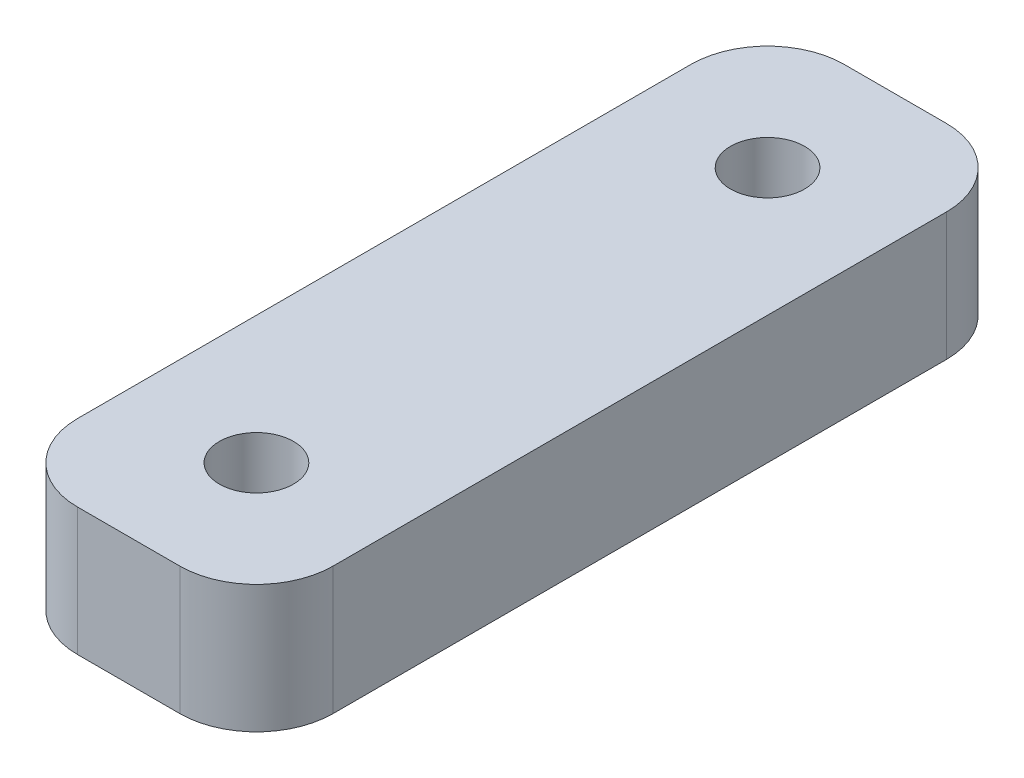
ISO-10303-21;
HEADER;
FILE_DESCRIPTION(('STEP AP214'),'2;1');
FILE_NAME('part.step','',(''),(''),'','','');
FILE_SCHEMA(('AUTOMOTIVE_DESIGN { 1 0 10303 214 1 1 1 1 }'));
ENDSEC;
DATA;
#1=APPLICATION_CONTEXT('core data for automotive mechanical design processes');
#2=APPLICATION_PROTOCOL_DEFINITION('international standard','automotive_design',2000,#1);
#3=PRODUCT_CONTEXT('',#1,'mechanical');
#4=PRODUCT('Part','Part','',(#3));
#5=PRODUCT_RELATED_PRODUCT_CATEGORY('part','',(#4));
#6=PRODUCT_DEFINITION_FORMATION('','',#4);
#7=PRODUCT_DEFINITION_CONTEXT('part definition',#1,'design');
#8=PRODUCT_DEFINITION('design','',#6,#7);
#9=PRODUCT_DEFINITION_SHAPE('','',#8);
#10=(LENGTH_UNIT() NAMED_UNIT(*) SI_UNIT(.MILLI.,.METRE.));
#11=(NAMED_UNIT(*) PLANE_ANGLE_UNIT() SI_UNIT($,.RADIAN.));
#12=(NAMED_UNIT(*) SI_UNIT($,.STERADIAN.) SOLID_ANGLE_UNIT());
#13=UNCERTAINTY_MEASURE_WITH_UNIT(LENGTH_MEASURE(1.E-05),#10,'distance_accuracy_value','');
#14=(GEOMETRIC_REPRESENTATION_CONTEXT(3) GLOBAL_UNCERTAINTY_ASSIGNED_CONTEXT((#13)) GLOBAL_UNIT_ASSIGNED_CONTEXT((#10,
#11,#12)) REPRESENTATION_CONTEXT('',''));
#15=CARTESIAN_POINT('',(0.,0.,0.));
#16=DIRECTION('',(0.,0.,1.));
#17=DIRECTION('',(1.,0.,0.));
#18=AXIS2_PLACEMENT_3D('',#15,#16,#17);
#19=CARTESIAN_POINT('',(0.,5.,0.));
#20=DIRECTION('',(0.,-1.,0.));
#21=DIRECTION('',(0.,0.,-1.));
#22=AXIS2_PLACEMENT_3D('',#19,#20,#21);
#23=PLANE('',#22);
#24=DIRECTION('',(0.,0.,-1.));
#25=VECTOR('',#24,1.);
#26=CARTESIAN_POINT('',(13.,5.,0.));
#27=LINE('',#26,#25);
#28=CARTESIAN_POINT('',(13.,5.,-3.));
#29=VERTEX_POINT('',#28);
#30=CARTESIAN_POINT('',(13.,5.,-27.));
#31=VERTEX_POINT('',#30);
#32=EDGE_CURVE('E168',#29,#31,#27,.T.);
#33=ORIENTED_EDGE('',*,*,#32,.T.);
#34=CARTESIAN_POINT('',(10.,5.,-27.));
#35=DIRECTION('',(0.,-1.,0.));
#36=DIRECTION('',(0.,0.,-1.));
#37=AXIS2_PLACEMENT_3D('',#34,#35,#36);
#38=CIRCLE('',#37,3.);
#39=CARTESIAN_POINT('',(10.,5.,-30.));
#40=VERTEX_POINT('',#39);
#41=EDGE_CURVE('E151',#31,#40,#38,.F.);
#42=ORIENTED_EDGE('',*,*,#41,.T.);
#43=DIRECTION('',(-1.,0.,0.));
#44=VECTOR('',#43,1.);
#45=CARTESIAN_POINT('',(3.,5.,-30.));
#46=LINE('',#45,#44);
#47=CARTESIAN_POINT('',(6.,5.,-30.));
#48=VERTEX_POINT('',#47);
#49=EDGE_CURVE('E122',#40,#48,#46,.T.);
#50=ORIENTED_EDGE('',*,*,#49,.T.);
#51=CARTESIAN_POINT('',(6.,5.,-27.));
#52=DIRECTION('',(0.,-1.,0.));
#53=DIRECTION('',(0.,0.,-1.));
#54=AXIS2_PLACEMENT_3D('',#51,#52,#53);
#55=CIRCLE('',#54,3.);
#56=CARTESIAN_POINT('',(3.,5.,-27.));
#57=VERTEX_POINT('',#56);
#58=EDGE_CURVE('E149',#48,#57,#55,.F.);
#59=ORIENTED_EDGE('',*,*,#58,.T.);
#60=DIRECTION('',(0.,0.,1.));
#61=VECTOR('',#60,1.);
#62=CARTESIAN_POINT('',(3.,5.,0.));
#63=LINE('',#62,#61);
#64=CARTESIAN_POINT('',(3.,5.,-3.));
#65=VERTEX_POINT('',#64);
#66=EDGE_CURVE('E129',#57,#65,#63,.T.);
#67=ORIENTED_EDGE('',*,*,#66,.T.);
#68=CARTESIAN_POINT('',(6.,5.,-3.));
#69=DIRECTION('',(0.,-1.,0.));
#70=DIRECTION('',(0.,0.,-1.));
#71=AXIS2_PLACEMENT_3D('',#68,#69,#70);
#72=CIRCLE('',#71,3.);
#73=CARTESIAN_POINT('',(6.,5.,0.));
#74=VERTEX_POINT('',#73);
#75=EDGE_CURVE('E57',#65,#74,#72,.F.);
#76=ORIENTED_EDGE('',*,*,#75,.T.);
#77=DIRECTION('',(1.,0.,0.));
#78=VECTOR('',#77,1.);
#79=CARTESIAN_POINT('',(3.,5.,0.));
#80=LINE('',#79,#78);
#81=CARTESIAN_POINT('',(10.,5.,0.));
#82=VERTEX_POINT('',#81);
#83=EDGE_CURVE('E132',#74,#82,#80,.T.);
#84=ORIENTED_EDGE('',*,*,#83,.T.);
#85=CARTESIAN_POINT('',(10.,5.,-3.));
#86=DIRECTION('',(0.,-1.,0.));
#87=DIRECTION('',(0.,0.,-1.));
#88=AXIS2_PLACEMENT_3D('',#85,#86,#87);
#89=CIRCLE('',#88,3.);
#90=EDGE_CURVE('E147',#82,#29,#89,.F.);
#91=ORIENTED_EDGE('',*,*,#90,.T.);
#92=EDGE_LOOP('',(#33,#42,#50,#59,#67,#76,#84,#91));
#93=FACE_BOUND('',#92,.T.);
#94=CARTESIAN_POINT('',(8.,5.,-25.));
#95=DIRECTION('',(0.,1.,0.));
#96=DIRECTION('',(0.,0.,1.));
#97=AXIS2_PLACEMENT_3D('',#94,#95,#96);
#98=CIRCLE('',#97,1.45);
#99=CARTESIAN_POINT('',(8.,5.,-23.55));
#100=VERTEX_POINT('',#99);
#101=EDGE_CURVE('E164',#100,#100,#98,.T.);
#102=ORIENTED_EDGE('',*,*,#101,.F.);
#103=EDGE_LOOP('',(#102));
#104=FACE_BOUND('',#103,.T.);
#105=CARTESIAN_POINT('',(8.,5.,-5.));
#106=DIRECTION('',(0.,1.,0.));
#107=DIRECTION('',(0.,0.,1.));
#108=AXIS2_PLACEMENT_3D('',#105,#106,#107);
#109=CIRCLE('',#108,1.45);
#110=CARTESIAN_POINT('',(8.,5.,-3.55));
#111=VERTEX_POINT('',#110);
#112=EDGE_CURVE('E175',#111,#111,#109,.T.);
#113=ORIENTED_EDGE('',*,*,#112,.F.);
#114=EDGE_LOOP('',(#113));
#115=FACE_BOUND('',#114,.T.);
#116=ADVANCED_FACE('F37',(#93,#104,#115),#23,.F.);
#117=CARTESIAN_POINT('',(0.,0.,0.));
#118=DIRECTION('',(0.,-1.,0.));
#119=DIRECTION('',(0.,0.,-1.));
#120=AXIS2_PLACEMENT_3D('',#117,#118,#119);
#121=PLANE('',#120);
#122=CARTESIAN_POINT('',(8.,0.,-25.));
#123=DIRECTION('',(0.,1.,0.));
#124=DIRECTION('',(0.,0.,1.));
#125=AXIS2_PLACEMENT_3D('',#122,#123,#124);
#126=CIRCLE('',#125,1.45);
#127=CARTESIAN_POINT('',(8.,0.,-23.55));
#128=VERTEX_POINT('',#127);
#129=EDGE_CURVE('E172',#128,#128,#126,.T.);
#130=ORIENTED_EDGE('',*,*,#129,.T.);
#131=EDGE_LOOP('',(#130));
#132=FACE_BOUND('',#131,.T.);
#133=DIRECTION('',(-1.,0.,0.));
#134=VECTOR('',#133,1.);
#135=CARTESIAN_POINT('',(3.,0.,-30.));
#136=LINE('',#135,#134);
#137=CARTESIAN_POINT('',(10.,0.,-30.));
#138=VERTEX_POINT('',#137);
#139=CARTESIAN_POINT('',(6.,0.,-30.));
#140=VERTEX_POINT('',#139);
#141=EDGE_CURVE('E119',#138,#140,#136,.T.);
#142=ORIENTED_EDGE('',*,*,#141,.F.);
#143=CARTESIAN_POINT('',(10.,0.,-27.));
#144=DIRECTION('',(0.,-1.,0.));
#145=DIRECTION('',(0.,0.,-1.));
#146=AXIS2_PLACEMENT_3D('',#143,#144,#145);
#147=CIRCLE('',#146,3.);
#148=CARTESIAN_POINT('',(13.,0.,-27.));
#149=VERTEX_POINT('',#148);
#150=EDGE_CURVE('E102',#138,#149,#147,.T.);
#151=ORIENTED_EDGE('',*,*,#150,.T.);
#152=DIRECTION('',(0.,0.,-1.));
#153=VECTOR('',#152,1.);
#154=CARTESIAN_POINT('',(13.,0.,0.));
#155=LINE('',#154,#153);
#156=CARTESIAN_POINT('',(13.,0.,-3.));
#157=VERTEX_POINT('',#156);
#158=EDGE_CURVE('E130',#157,#149,#155,.T.);
#159=ORIENTED_EDGE('',*,*,#158,.F.);
#160=CARTESIAN_POINT('',(10.,0.,-3.));
#161=DIRECTION('',(0.,-1.,0.));
#162=DIRECTION('',(0.,0.,-1.));
#163=AXIS2_PLACEMENT_3D('',#160,#161,#162);
#164=CIRCLE('',#163,3.);
#165=CARTESIAN_POINT('',(10.,0.,0.));
#166=VERTEX_POINT('',#165);
#167=EDGE_CURVE('E140',#157,#166,#164,.T.);
#168=ORIENTED_EDGE('',*,*,#167,.T.);
#169=DIRECTION('',(1.,0.,0.));
#170=VECTOR('',#169,1.);
#171=CARTESIAN_POINT('',(3.,0.,0.));
#172=LINE('',#171,#170);
#173=CARTESIAN_POINT('',(6.,0.,0.));
#174=VERTEX_POINT('',#173);
#175=EDGE_CURVE('E134',#174,#166,#172,.T.);
#176=ORIENTED_EDGE('',*,*,#175,.F.);
#177=CARTESIAN_POINT('',(6.,0.,-3.));
#178=DIRECTION('',(0.,-1.,0.));
#179=DIRECTION('',(0.,0.,-1.));
#180=AXIS2_PLACEMENT_3D('',#177,#178,#179);
#181=CIRCLE('',#180,3.);
#182=CARTESIAN_POINT('',(3.,0.,-3.));
#183=VERTEX_POINT('',#182);
#184=EDGE_CURVE('E123',#174,#183,#181,.T.);
#185=ORIENTED_EDGE('',*,*,#184,.T.);
#186=DIRECTION('',(0.,0.,1.));
#187=VECTOR('',#186,1.);
#188=CARTESIAN_POINT('',(3.,0.,0.));
#189=LINE('',#188,#187);
#190=CARTESIAN_POINT('',(3.,0.,-27.));
#191=VERTEX_POINT('',#190);
#192=EDGE_CURVE('E163',#191,#183,#189,.T.);
#193=ORIENTED_EDGE('',*,*,#192,.F.);
#194=CARTESIAN_POINT('',(6.,0.,-27.));
#195=DIRECTION('',(0.,-1.,0.));
#196=DIRECTION('',(0.,0.,-1.));
#197=AXIS2_PLACEMENT_3D('',#194,#195,#196);
#198=CIRCLE('',#197,3.);
#199=EDGE_CURVE('E113',#191,#140,#198,.T.);
#200=ORIENTED_EDGE('',*,*,#199,.T.);
#201=EDGE_LOOP('',(#142,#151,#159,#168,#176,#185,#193,#200));
#202=FACE_BOUND('',#201,.T.);
#203=CARTESIAN_POINT('',(8.,0.,-5.));
#204=DIRECTION('',(0.,1.,0.));
#205=DIRECTION('',(0.,0.,1.));
#206=AXIS2_PLACEMENT_3D('',#203,#204,#205);
#207=CIRCLE('',#206,1.45);
#208=CARTESIAN_POINT('',(8.,0.,-3.55));
#209=VERTEX_POINT('',#208);
#210=EDGE_CURVE('E178',#209,#209,#207,.T.);
#211=ORIENTED_EDGE('',*,*,#210,.T.);
#212=EDGE_LOOP('',(#211));
#213=FACE_BOUND('',#212,.T.);
#214=ADVANCED_FACE('F126',(#132,#202,#213),#121,.T.);
#215=CARTESIAN_POINT('',(3.,5.,0.));
#216=DIRECTION('',(1.,0.,0.));
#217=DIRECTION('',(0.,0.,-1.));
#218=AXIS2_PLACEMENT_3D('',#215,#216,#217);
#219=PLANE('',#218);
#220=ORIENTED_EDGE('',*,*,#66,.F.);
#221=DIRECTION('',(0.,-1.,0.));
#222=VECTOR('',#221,1.);
#223=CARTESIAN_POINT('',(3.,5.,-27.));
#224=LINE('',#223,#222);
#225=EDGE_CURVE('E155',#57,#191,#224,.T.);
#226=ORIENTED_EDGE('',*,*,#225,.T.);
#227=ORIENTED_EDGE('',*,*,#192,.T.);
#228=DIRECTION('',(0.,-1.,0.));
#229=VECTOR('',#228,1.);
#230=CARTESIAN_POINT('',(3.,5.,-3.));
#231=LINE('',#230,#229);
#232=EDGE_CURVE('E153',#183,#65,#231,.F.);
#233=ORIENTED_EDGE('',*,*,#232,.T.);
#234=EDGE_LOOP('',(#220,#226,#227,#233));
#235=FACE_BOUND('',#234,.T.);
#236=ADVANCED_FACE('F192',(#235),#219,.F.);
#237=CARTESIAN_POINT('',(3.,5.,0.));
#238=DIRECTION('',(0.,0.,-1.));
#239=DIRECTION('',(-1.,0.,0.));
#240=AXIS2_PLACEMENT_3D('',#237,#238,#239);
#241=PLANE('',#240);
#242=ORIENTED_EDGE('',*,*,#175,.T.);
#243=DIRECTION('',(0.,-1.,0.));
#244=VECTOR('',#243,1.);
#245=CARTESIAN_POINT('',(10.,5.,0.));
#246=LINE('',#245,#244);
#247=EDGE_CURVE('E11',#166,#82,#246,.F.);
#248=ORIENTED_EDGE('',*,*,#247,.T.);
#249=ORIENTED_EDGE('',*,*,#83,.F.);
#250=DIRECTION('',(0.,-1.,0.));
#251=VECTOR('',#250,1.);
#252=CARTESIAN_POINT('',(6.,5.,0.));
#253=LINE('',#252,#251);
#254=EDGE_CURVE('E45',#74,#174,#253,.T.);
#255=ORIENTED_EDGE('',*,*,#254,.T.);
#256=EDGE_LOOP('',(#242,#248,#249,#255));
#257=FACE_BOUND('',#256,.T.);
#258=ADVANCED_FACE('F160',(#257),#241,.F.);
#259=CARTESIAN_POINT('',(13.,5.,0.));
#260=DIRECTION('',(-1.,0.,0.));
#261=DIRECTION('',(0.,0.,1.));
#262=AXIS2_PLACEMENT_3D('',#259,#260,#261);
#263=PLANE('',#262);
#264=ORIENTED_EDGE('',*,*,#158,.T.);
#265=DIRECTION('',(0.,-1.,0.));
#266=VECTOR('',#265,1.);
#267=CARTESIAN_POINT('',(13.,5.,-27.));
#268=LINE('',#267,#266);
#269=EDGE_CURVE('E107',#149,#31,#268,.F.);
#270=ORIENTED_EDGE('',*,*,#269,.T.);
#271=ORIENTED_EDGE('',*,*,#32,.F.);
#272=DIRECTION('',(0.,-1.,0.));
#273=VECTOR('',#272,1.);
#274=CARTESIAN_POINT('',(13.,5.,-3.));
#275=LINE('',#274,#273);
#276=EDGE_CURVE('E112',#29,#157,#275,.T.);
#277=ORIENTED_EDGE('',*,*,#276,.T.);
#278=EDGE_LOOP('',(#264,#270,#271,#277));
#279=FACE_BOUND('',#278,.T.);
#280=ADVANCED_FACE('F202',(#279),#263,.F.);
#281=CARTESIAN_POINT('',(3.,5.,-30.));
#282=DIRECTION('',(0.,0.,1.));
#283=DIRECTION('',(1.,0.,0.));
#284=AXIS2_PLACEMENT_3D('',#281,#282,#283);
#285=PLANE('',#284);
#286=ORIENTED_EDGE('',*,*,#49,.F.);
#287=DIRECTION('',(0.,-1.,0.));
#288=VECTOR('',#287,1.);
#289=CARTESIAN_POINT('',(10.,5.,-30.));
#290=LINE('',#289,#288);
#291=EDGE_CURVE('E106',#40,#138,#290,.T.);
#292=ORIENTED_EDGE('',*,*,#291,.T.);
#293=ORIENTED_EDGE('',*,*,#141,.T.);
#294=DIRECTION('',(0.,-1.,0.));
#295=VECTOR('',#294,1.);
#296=CARTESIAN_POINT('',(6.,5.,-30.));
#297=LINE('',#296,#295);
#298=EDGE_CURVE('E124',#140,#48,#297,.F.);
#299=ORIENTED_EDGE('',*,*,#298,.T.);
#300=EDGE_LOOP('',(#286,#292,#293,#299));
#301=FACE_BOUND('',#300,.T.);
#302=ADVANCED_FACE('F118',(#301),#285,.F.);
#303=CARTESIAN_POINT('',(8.,5.,-25.));
#304=DIRECTION('',(0.,-1.,0.));
#305=DIRECTION('',(0.,0.,-1.));
#306=AXIS2_PLACEMENT_3D('',#303,#304,#305);
#307=CYLINDRICAL_SURFACE('',#306,1.45);
#308=ORIENTED_EDGE('',*,*,#101,.T.);
#309=EDGE_LOOP('',(#308));
#310=FACE_BOUND('',#309,.T.);
#311=ORIENTED_EDGE('',*,*,#129,.F.);
#312=EDGE_LOOP('',(#311));
#313=FACE_BOUND('',#312,.T.);
#314=ADVANCED_FACE('F197',(#310,#313),#307,.F.);
#315=CARTESIAN_POINT('',(8.,5.,-5.));
#316=DIRECTION('',(0.,-1.,0.));
#317=DIRECTION('',(0.,0.,-1.));
#318=AXIS2_PLACEMENT_3D('',#315,#316,#317);
#319=CYLINDRICAL_SURFACE('',#318,1.45);
#320=ORIENTED_EDGE('',*,*,#112,.T.);
#321=EDGE_LOOP('',(#320));
#322=FACE_BOUND('',#321,.T.);
#323=ORIENTED_EDGE('',*,*,#210,.F.);
#324=EDGE_LOOP('',(#323));
#325=FACE_BOUND('',#324,.T.);
#326=ADVANCED_FACE('F184',(#322,#325),#319,.F.);
#327=CARTESIAN_POINT('',(10.,5.,-27.));
#328=DIRECTION('',(0.,-1.,0.));
#329=DIRECTION('',(0.,0.,-1.));
#330=AXIS2_PLACEMENT_3D('',#327,#328,#329);
#331=CYLINDRICAL_SURFACE('',#330,3.);
#332=ORIENTED_EDGE('',*,*,#41,.F.);
#333=ORIENTED_EDGE('',*,*,#269,.F.);
#334=ORIENTED_EDGE('',*,*,#150,.F.);
#335=ORIENTED_EDGE('',*,*,#291,.F.);
#336=EDGE_LOOP('',(#332,#333,#334,#335));
#337=FACE_BOUND('',#336,.T.);
#338=ADVANCED_FACE('F105',(#337),#331,.T.);
#339=CARTESIAN_POINT('',(6.,5.,-27.));
#340=DIRECTION('',(0.,-1.,0.));
#341=DIRECTION('',(0.,0.,-1.));
#342=AXIS2_PLACEMENT_3D('',#339,#340,#341);
#343=CYLINDRICAL_SURFACE('',#342,3.);
#344=ORIENTED_EDGE('',*,*,#58,.F.);
#345=ORIENTED_EDGE('',*,*,#298,.F.);
#346=ORIENTED_EDGE('',*,*,#199,.F.);
#347=ORIENTED_EDGE('',*,*,#225,.F.);
#348=EDGE_LOOP('',(#344,#345,#346,#347));
#349=FACE_BOUND('',#348,.T.);
#350=ADVANCED_FACE('F213',(#349),#343,.T.);
#351=CARTESIAN_POINT('',(10.,5.,-3.));
#352=DIRECTION('',(0.,-1.,0.));
#353=DIRECTION('',(0.,0.,-1.));
#354=AXIS2_PLACEMENT_3D('',#351,#352,#353);
#355=CYLINDRICAL_SURFACE('',#354,3.);
#356=ORIENTED_EDGE('',*,*,#90,.F.);
#357=ORIENTED_EDGE('',*,*,#247,.F.);
#358=ORIENTED_EDGE('',*,*,#167,.F.);
#359=ORIENTED_EDGE('',*,*,#276,.F.);
#360=EDGE_LOOP('',(#356,#357,#358,#359));
#361=FACE_BOUND('',#360,.T.);
#362=ADVANCED_FACE('F215',(#361),#355,.T.);
#363=CARTESIAN_POINT('',(6.,5.,-3.));
#364=DIRECTION('',(0.,-1.,0.));
#365=DIRECTION('',(0.,0.,-1.));
#366=AXIS2_PLACEMENT_3D('',#363,#364,#365);
#367=CYLINDRICAL_SURFACE('',#366,3.);
#368=ORIENTED_EDGE('',*,*,#75,.F.);
#369=ORIENTED_EDGE('',*,*,#232,.F.);
#370=ORIENTED_EDGE('',*,*,#184,.F.);
#371=ORIENTED_EDGE('',*,*,#254,.F.);
#372=EDGE_LOOP('',(#368,#369,#370,#371));
#373=FACE_BOUND('',#372,.T.);
#374=ADVANCED_FACE('F39',(#373),#367,.T.);
#375=CLOSED_SHELL('',(#116,#214,#236,#258,#280,#302,#314,#326,#338,#350,#362,#374));
#376=MANIFOLD_SOLID_BREP('B2',#375);
#377=ADVANCED_BREP_SHAPE_REPRESENTATION('',(#18,#376),#14);
#378=SHAPE_DEFINITION_REPRESENTATION(#9,#377);
ENDSEC;
END-ISO-10303-21;
